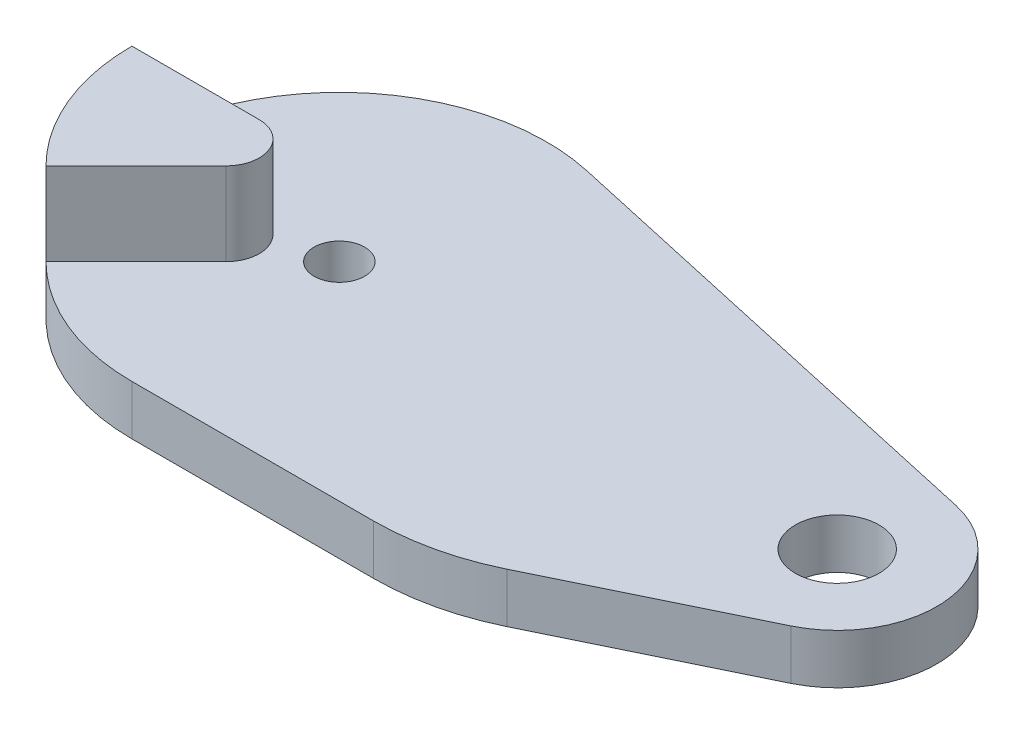
ISO-10303-21;
HEADER;
FILE_DESCRIPTION(('STEP AP214'),'2;1');
FILE_NAME('part.step','',(''),(''),'','','');
FILE_SCHEMA(('AUTOMOTIVE_DESIGN { 1 0 10303 214 1 1 1 1 }'));
ENDSEC;
DATA;
#1=APPLICATION_CONTEXT('core data for automotive mechanical design processes');
#2=APPLICATION_PROTOCOL_DEFINITION('international standard','automotive_design',2000,#1);
#3=PRODUCT_CONTEXT('',#1,'mechanical');
#4=PRODUCT('Part','Part','',(#3));
#5=PRODUCT_RELATED_PRODUCT_CATEGORY('part','',(#4));
#6=PRODUCT_DEFINITION_FORMATION('','',#4);
#7=PRODUCT_DEFINITION_CONTEXT('part definition',#1,'design');
#8=PRODUCT_DEFINITION('design','',#6,#7);
#9=PRODUCT_DEFINITION_SHAPE('','',#8);
#10=(LENGTH_UNIT() NAMED_UNIT(*) SI_UNIT(.MILLI.,.METRE.));
#11=(NAMED_UNIT(*) PLANE_ANGLE_UNIT() SI_UNIT($,.RADIAN.));
#12=(NAMED_UNIT(*) SI_UNIT($,.STERADIAN.) SOLID_ANGLE_UNIT());
#13=UNCERTAINTY_MEASURE_WITH_UNIT(LENGTH_MEASURE(1.E-05),#10,'distance_accuracy_value','');
#14=(GEOMETRIC_REPRESENTATION_CONTEXT(3) GLOBAL_UNCERTAINTY_ASSIGNED_CONTEXT((#13)) GLOBAL_UNIT_ASSIGNED_CONTEXT((#10,
#11,#12)) REPRESENTATION_CONTEXT('',''));
#15=CARTESIAN_POINT('',(0.,0.,0.));
#16=DIRECTION('',(0.,0.,1.));
#17=DIRECTION('',(1.,0.,0.));
#18=AXIS2_PLACEMENT_3D('',#15,#16,#17);
#19=CARTESIAN_POINT('',(0.,0.,0.));
#20=DIRECTION('',(0.,1.,0.));
#21=DIRECTION('',(0.,0.,1.));
#22=AXIS2_PLACEMENT_3D('',#19,#20,#21);
#23=PLANE('',#22);
#24=CARTESIAN_POINT('',(0.,0.,0.));
#25=DIRECTION('',(0.,1.,0.));
#26=DIRECTION('',(0.,0.,1.));
#27=AXIS2_PLACEMENT_3D('',#24,#25,#26);
#28=CIRCLE('',#27,3.05);
#29=CARTESIAN_POINT('',(0.,0.,3.05));
#30=VERTEX_POINT('',#29);
#31=EDGE_CURVE('E187',#30,#30,#28,.T.);
#32=ORIENTED_EDGE('',*,*,#31,.T.);
#33=EDGE_LOOP('',(#32));
#34=FACE_BOUND('',#33,.T.);
#35=CARTESIAN_POINT('',(0.,0.,0.));
#36=DIRECTION('',(0.,1.,0.));
#37=DIRECTION('',(0.,0.,1.));
#38=AXIS2_PLACEMENT_3D('',#35,#36,#37);
#39=CIRCLE('',#38,12.5);
#40=CARTESIAN_POINT('',(5.93717104351896,0.,11.));
#41=VERTEX_POINT('',#40);
#42=CARTESIAN_POINT('',(5.93717104351896,0.,-11.));
#43=VERTEX_POINT('',#42);
#44=EDGE_CURVE('E183',#41,#43,#39,.T.);
#45=ORIENTED_EDGE('',*,*,#44,.F.);
#46=DIRECTION('',(1.,0.,0.));
#47=VECTOR('',#46,1.);
#48=CARTESIAN_POINT('',(0.,0.,11.));
#49=LINE('',#48,#47);
#50=CARTESIAN_POINT('',(-5.93717104351896,0.,11.));
#51=VERTEX_POINT('',#50);
#52=EDGE_CURVE('E170',#51,#41,#49,.T.);
#53=ORIENTED_EDGE('',*,*,#52,.F.);
#54=CARTESIAN_POINT('',(-5.93717104351896,0.,-11.));
#55=VERTEX_POINT('',#54);
#56=EDGE_CURVE('E181',#55,#51,#39,.T.);
#57=ORIENTED_EDGE('',*,*,#56,.F.);
#58=DIRECTION('',(1.,0.,0.));
#59=VECTOR('',#58,1.);
#60=CARTESIAN_POINT('',(0.,0.,-11.));
#61=LINE('',#60,#59);
#62=EDGE_CURVE('E421',#55,#43,#61,.T.);
#63=ORIENTED_EDGE('',*,*,#62,.T.);
#64=EDGE_LOOP('',(#45,#53,#57,#63));
#65=FACE_BOUND('',#64,.T.);
#66=ADVANCED_FACE('F65',(#34,#65),#23,.F.);
#67=CARTESIAN_POINT('',(0.,8.,0.));
#68=DIRECTION('',(0.,-1.,0.));
#69=DIRECTION('',(0.,0.,-1.));
#70=AXIS2_PLACEMENT_3D('',#67,#68,#69);
#71=CYLINDRICAL_SURFACE('',#70,12.5);
#72=CARTESIAN_POINT('',(0.,6.,0.));
#73=DIRECTION('',(0.,-1.,0.));
#74=DIRECTION('',(0.,0.,-1.));
#75=AXIS2_PLACEMENT_3D('',#72,#73,#74);
#76=CIRCLE('',#75,12.5);
#77=CARTESIAN_POINT('',(5.93717104351896,6.,-11.));
#78=VERTEX_POINT('',#77);
#79=CARTESIAN_POINT('',(5.93717104351896,6.,11.));
#80=VERTEX_POINT('',#79);
#81=EDGE_CURVE('E350',#78,#80,#76,.T.);
#82=ORIENTED_EDGE('',*,*,#81,.T.);
#83=DIRECTION('',(0.,-1.,0.));
#84=VECTOR('',#83,1.);
#85=CARTESIAN_POINT('',(5.93717104351896,17.9687092035858,11.));
#86=LINE('',#85,#84);
#87=EDGE_CURVE('E175',#80,#41,#86,.T.);
#88=ORIENTED_EDGE('',*,*,#87,.T.);
#89=ORIENTED_EDGE('',*,*,#44,.T.);
#90=DIRECTION('',(0.,-1.,0.));
#91=VECTOR('',#90,1.);
#92=CARTESIAN_POINT('',(5.93717104351896,17.9687092035858,-11.));
#93=LINE('',#92,#91);
#94=EDGE_CURVE('E420',#78,#43,#93,.T.);
#95=ORIENTED_EDGE('',*,*,#94,.F.);
#96=EDGE_LOOP('',(#82,#88,#89,#95));
#97=FACE_BOUND('',#96,.T.);
#98=ADVANCED_FACE('F278',(#97),#71,.T.);
#99=ORIENTED_EDGE('',*,*,#56,.T.);
#100=DIRECTION('',(0.,-1.,0.));
#101=VECTOR('',#100,1.);
#102=CARTESIAN_POINT('',(-5.93717104351896,17.9687092035858,11.));
#103=LINE('',#102,#101);
#104=CARTESIAN_POINT('',(-5.93717104351896,6.,11.));
#105=VERTEX_POINT('',#104);
#106=EDGE_CURVE('E166',#105,#51,#103,.T.);
#107=ORIENTED_EDGE('',*,*,#106,.F.);
#108=CARTESIAN_POINT('',(-5.93717104351896,6.,-11.));
#109=VERTEX_POINT('',#108);
#110=EDGE_CURVE('E349',#105,#109,#76,.T.);
#111=ORIENTED_EDGE('',*,*,#110,.T.);
#112=DIRECTION('',(0.,-1.,0.));
#113=VECTOR('',#112,1.);
#114=CARTESIAN_POINT('',(-5.93717104351896,17.9687092035858,-11.));
#115=LINE('',#114,#113);
#116=EDGE_CURVE('E81',#109,#55,#115,.T.);
#117=ORIENTED_EDGE('',*,*,#116,.T.);
#118=EDGE_LOOP('',(#99,#107,#111,#117));
#119=FACE_BOUND('',#118,.T.);
#120=ADVANCED_FACE('F186',(#119),#71,.T.);
#121=CARTESIAN_POINT('',(0.,3.3,-12.5));
#122=DIRECTION('',(0.,0.,1.));
#123=DIRECTION('',(1.,0.,0.));
#124=AXIS2_PLACEMENT_3D('',#121,#122,#123);
#125=CYLINDRICAL_SURFACE('',#124,1.6);
#126=CARTESIAN_POINT('',(0.,4.9,-3.05));
#127=CARTESIAN_POINT('',(-0.0836110050453581,4.89999455650102,-3.04999517700509));
#128=CARTESIAN_POINT('',(-0.167306428380569,4.89340785872216,-3.04652589814843));
#129=CARTESIAN_POINT('',(-0.332191821665101,4.86736761047759,-3.03298901559862));
#130=CARTESIAN_POINT('',(-0.41337744453983,4.84789291591933,-3.02291056912914));
#131=CARTESIAN_POINT('',(-0.570613153127324,4.79706399807992,-2.99720260155738));
#132=CARTESIAN_POINT('',(-0.64668239885405,4.76575738147327,-2.98159534164387));
#133=CARTESIAN_POINT('',(-0.792357900481189,4.69241738866397,-2.94623419512776));
#134=CARTESIAN_POINT('',(-0.861964263345972,4.65038419003549,-2.92648037717069));
#135=CARTESIAN_POINT('',(-0.997798318782131,4.55371076067794,-2.88310679073146));
#136=CARTESIAN_POINT('',(-1.06351666988197,4.49843117858787,-2.859319653945));
#137=CARTESIAN_POINT('',(-1.18522587445246,4.37822360035397,-2.81105572902165));
#138=CARTESIAN_POINT('',(-1.24120850706307,4.31328753525379,-2.78657837813787));
#139=CARTESIAN_POINT('',(-1.3467876012229,4.16882083429098,-2.73721560194913));
#140=CARTESIAN_POINT('',(-1.39539667719393,4.08851034451157,-2.71248186972032));
#141=CARTESIAN_POINT('',(-1.47821785577007,3.91944545804245,-2.66825595257666));
#142=CARTESIAN_POINT('',(-1.51244089981633,3.83069754174642,-2.64875978826508));
#143=CARTESIAN_POINT('',(-1.56317686282866,3.65282461369514,-2.61912187860583));
#144=CARTESIAN_POINT('',(-1.5806560469441,3.56406395204097,-2.60847521031483));
#145=CARTESIAN_POINT('',(-1.60032679539884,3.38428674524894,-2.59645976696876));
#146=CARTESIAN_POINT('',(-1.60253644934951,3.29327299770229,-2.59508001357605));
#147=CARTESIAN_POINT('',(-1.59231112345977,3.12481316320863,-2.60135681056238));
#148=CARTESIAN_POINT('',(-1.58181195806415,3.04719343145767,-2.60781918576659));
#149=CARTESIAN_POINT('',(-1.54985517155484,2.89503685895057,-2.62693591844801));
#150=CARTESIAN_POINT('',(-1.52839341169479,2.82050119402981,-2.63959261441304));
#151=CARTESIAN_POINT('',(-1.47477217782312,2.67451021239191,-2.66992681382473));
#152=CARTESIAN_POINT('',(-1.44237993660731,2.60316388490232,-2.68771221954179));
#153=CARTESIAN_POINT('',(-1.36800477135078,2.46656234914093,-2.7263193459757));
#154=CARTESIAN_POINT('',(-1.32601756253087,2.40130988056908,-2.74714242170351));
#155=CARTESIAN_POINT('',(-1.22673326593071,2.26903155683991,-2.79303030943981));
#156=CARTESIAN_POINT('',(-1.16811065163519,2.20306057289718,-2.81827847110633));
#157=CARTESIAN_POINT('',(-1.04059337899233,2.08142080073434,-2.86781214667249));
#158=CARTESIAN_POINT('',(-0.971692869974616,2.02575792109897,-2.89209710223632));
#159=CARTESIAN_POINT('',(-0.820740647513362,1.9233543393171,-2.93861464263574));
#160=CARTESIAN_POINT('',(-0.738169212285077,1.87728596283712,-2.96065672738557));
#161=CARTESIAN_POINT('',(-0.565004905102359,1.80008897506982,-2.99851580446222));
#162=CARTESIAN_POINT('',(-0.474419068631023,1.76894741136602,-3.01433819164323));
#163=CARTESIAN_POINT('',(-0.296343036097651,1.72525207958017,-3.03677685758856));
#164=CARTESIAN_POINT('',(-0.209283174619134,1.71130246738174,-3.04408137162577));
#165=CARTESIAN_POINT('',(-0.0337678143322872,1.6979411600416,-3.05107459307041));
#166=CARTESIAN_POINT('',(0.0546868918974523,1.69852148648514,-3.05076748003652));
#167=CARTESIAN_POINT('',(0.222261120633014,1.71347654786282,-3.04294690530863));
#168=CARTESIAN_POINT('',(0.301522473378709,1.72664490565815,-3.03606369806689));
#169=CARTESIAN_POINT('',(0.456527872639768,1.76443893700297,-3.01665136822864));
#170=CARTESIAN_POINT('',(0.532271546832611,1.78906582033417,-3.00412164948249));
#171=CARTESIAN_POINT('',(0.680409637622107,1.84961542063141,-2.97412294261102));
#172=CARTESIAN_POINT('',(0.752665352454752,1.88581575597123,-2.95653375763504));
#173=CARTESIAN_POINT('',(0.890294387704052,1.9681537821101,-2.91804565699983));
#174=CARTESIAN_POINT('',(0.955664928691706,2.01429546334583,-2.89714541318244));
#175=CARTESIAN_POINT('',(1.08498511623705,2.12078716825915,-2.85140171616678));
#176=CARTESIAN_POINT('',(1.14806026144041,2.18212172109822,-2.82637478821565));
#177=CARTESIAN_POINT('',(1.26345922508927,2.31441119365977,-2.77671130755486));
#178=CARTESIAN_POINT('',(1.31577375066828,2.38537434160053,-2.7520751090808));
#179=CARTESIAN_POINT('',(1.41129657900498,2.5403745197948,-2.70439793263665));
#180=CARTESIAN_POINT('',(1.45373748753615,2.62494981651054,-2.6815510703486));
#181=CARTESIAN_POINT('',(1.52334205942745,2.80159483835205,-2.64263875687894));
#182=CARTESIAN_POINT('',(1.55052704827709,2.89365389503911,-2.62656384740357));
#183=CARTESIAN_POINT('',(1.58620051535253,3.07307748344927,-2.60516086699517));
#184=CARTESIAN_POINT('',(1.59625878046835,3.16001932668319,-2.59893477717467));
#185=CARTESIAN_POINT('',(1.60200350958647,3.33453714083777,-2.59540043680358));
#186=CARTESIAN_POINT('',(1.59769866270163,3.42211269639874,-2.5980867945703));
#187=CARTESIAN_POINT('',(1.57634037251977,3.58479140400219,-2.6110861836083));
#188=CARTESIAN_POINT('',(1.56080020023768,3.66017609553527,-2.62049247072563));
#189=CARTESIAN_POINT('',(1.51941962429058,3.8071449722835,-2.64469943748282));
#190=CARTESIAN_POINT('',(1.49357556899147,3.87872779993836,-2.65950202938117));
#191=CARTESIAN_POINT('',(1.43045670677683,4.0212953716003,-2.69400519922494));
#192=CARTESIAN_POINT('',(1.39254346462314,4.09193309027499,-2.71396330851015));
#193=CARTESIAN_POINT('',(1.30701559790143,4.22631627316641,-2.7561720524641));
#194=CARTESIAN_POINT('',(1.25939575644108,4.29005800275725,-2.7784239167382));
#195=CARTESIAN_POINT('',(1.14810442822523,4.41803657579401,-2.82639569886052));
#196=CARTESIAN_POINT('',(1.08312351653135,4.48112091253596,-2.85216935720769));
#197=CARTESIAN_POINT('',(0.942903791930802,4.59581536913892,-2.9015436493127));
#198=CARTESIAN_POINT('',(0.867658720167137,4.6474184370686,-2.92514294236523));
#199=CARTESIAN_POINT('',(0.706919773010004,4.73838586255544,-2.96813330877579));
#200=CARTESIAN_POINT('',(0.621256595958553,4.77749570553711,-2.98743470182243));
#201=CARTESIAN_POINT('',(0.443338336959858,4.84022493559491,-3.01894839595394));
#202=CARTESIAN_POINT('',(0.35110195214757,4.86388645600461,-3.03117996852047));
#203=CARTESIAN_POINT('',(0.214843288011331,4.8860963019435,-3.04272489307524));
#204=CARTESIAN_POINT('',(0.172094969544414,4.89130106575374,-3.04544427350963));
#205=CARTESIAN_POINT('',(0.0862385933399973,4.89825435315199,-3.04908308883221));
#206=CARTESIAN_POINT('',(0.0431305284664786,4.90000280801538,-3.0500024879299));
#207=CARTESIAN_POINT('',(0.,4.9,-3.05));
#208=B_SPLINE_CURVE_WITH_KNOTS('',3,(#126,#127,#128,#129,#130,#131,#132,#133,#134,#135,#136,
#137,#138,#139,#140,#141,#142,#143,#144,#145,#146,#147,#148,#149,#150,#151,#152,#153,#154,#155,
#156,#157,#158,#159,#160,#161,#162,#163,#164,#165,#166,#167,#168,#169,#170,#171,#172,#173,#174,
#175,#176,#177,#178,#179,#180,#181,#182,#183,#184,#185,#186,#187,#188,#189,#190,#191,#192,#193,
#194,#195,#196,#197,#198,#199,#200,#201,#202,#203,#204,#205,#206,#207),.UNSPECIFIED.,.T.,.F.,(4,
2,2,2,2,2,2,2,2,2,2,2,2,2,2,2,2,2,2,2,2,2,2,2,2,2,2,2,2,2,2,2,2,2,2,2,2,2,2,2,4),(0.,
0.250658754208306,0.501729762912424,0.751801140503482,1.00186837853366,1.26810210223369,
1.53455955403315,1.82433168016992,2.1138830166977,2.38548666885169,2.65676850048792,
2.89144544038274,3.12621104423379,3.36632969040414,3.60655577548953,3.88076383655907,
4.15512858991027,4.44482381121525,4.73426719867742,4.99821133082684,5.26201053397124,
5.50282368426325,5.74366226518102,5.99077646561658,6.23799004262053,6.51123596988036,
6.78471689052737,7.07518363207381,7.36524332677427,7.62690724924094,7.88841290412563,
8.12003101787473,8.35173128875636,8.5986251672399,8.84565209243475,9.12686877824567,
9.40825771675036,9.69505938135874,9.98107552659207,10.1103746489914,10.2396763423257),.UNSPECIFIED.);
#209=CARTESIAN_POINT('',(0.,4.9,-3.05));
#210=VERTEX_POINT('',#209);
#211=EDGE_CURVE('E191',#210,#210,#208,.T.);
#212=ORIENTED_EDGE('',*,*,#211,.T.);
#213=EDGE_LOOP('',(#212));
#214=FACE_BOUND('',#213,.T.);
#215=CARTESIAN_POINT('',(0.,3.3,-11.));
#216=DIRECTION('',(0.,0.,-1.));
#217=DIRECTION('',(-1.,0.,0.));
#218=AXIS2_PLACEMENT_3D('',#215,#216,#217);
#219=CIRCLE('',#218,1.6);
#220=CARTESIAN_POINT('',(-1.6,3.3,-11.));
#221=VERTEX_POINT('',#220);
#222=EDGE_CURVE('E69',#221,#221,#219,.F.);
#223=ORIENTED_EDGE('',*,*,#222,.F.);
#224=EDGE_LOOP('',(#223));
#225=FACE_BOUND('',#224,.T.);
#226=ADVANCED_FACE('F211',(#214,#225),#125,.F.);
#227=CARTESIAN_POINT('',(60.,14.,0.));
#228=DIRECTION('',(0.,1.,0.));
#229=DIRECTION('',(0.,0.,1.));
#230=AXIS2_PLACEMENT_3D('',#227,#228,#229);
#231=PLANE('',#230);
#232=CARTESIAN_POINT('',(0.,14.,0.));
#233=DIRECTION('',(0.,1.,0.));
#234=DIRECTION('',(0.,0.,1.));
#235=AXIS2_PLACEMENT_3D('',#232,#233,#234);
#236=CIRCLE('',#235,3.05);
#237=CARTESIAN_POINT('',(0.,14.,3.05));
#238=VERTEX_POINT('',#237);
#239=EDGE_CURVE('E338',#238,#238,#236,.F.);
#240=ORIENTED_EDGE('',*,*,#239,.T.);
#241=EDGE_LOOP('',(#240));
#242=FACE_BOUND('',#241,.T.);
#243=DIRECTION('',(-1.,0.,0.));
#244=VECTOR('',#243,1.);
#245=CARTESIAN_POINT('',(0.,14.,0.));
#246=LINE('',#245,#244);
#247=CARTESIAN_POINT('',(-9.65685424949236,14.,0.));
#248=VERTEX_POINT('',#247);
#249=CARTESIAN_POINT('',(-25.,14.,-1.72084568816899E-13));
#250=VERTEX_POINT('',#249);
#251=EDGE_CURVE('E334',#248,#250,#246,.T.);
#252=ORIENTED_EDGE('',*,*,#251,.F.);
#253=CARTESIAN_POINT('',(-9.65685424949239,14.,3.99999999999993));
#254=DIRECTION('',(0.,1.,0.));
#255=DIRECTION('',(0.,0.,1.));
#256=AXIS2_PLACEMENT_3D('',#253,#254,#255);
#257=CIRCLE('',#256,4.);
#258=CARTESIAN_POINT('',(-6.82842712474621,14.,6.82842712474614));
#259=VERTEX_POINT('',#258);
#260=EDGE_CURVE('E12',#248,#259,#257,.F.);
#261=ORIENTED_EDGE('',*,*,#260,.T.);
#262=DIRECTION('',(0.707106781186551,0.,-0.707106781186544));
#263=VECTOR('',#262,1.);
#264=CARTESIAN_POINT('',(0.,14.,0.));
#265=LINE('',#264,#263);
#266=CARTESIAN_POINT('',(-17.6776695296638,14.,17.6776695296636));
#267=VERTEX_POINT('',#266);
#268=EDGE_CURVE('E331',#267,#259,#265,.T.);
#269=ORIENTED_EDGE('',*,*,#268,.F.);
#270=CARTESIAN_POINT('',(0.,14.,0.));
#271=DIRECTION('',(0.,-1.,0.));
#272=DIRECTION('',(0.,0.,-1.));
#273=AXIS2_PLACEMENT_3D('',#270,#271,#272);
#274=CIRCLE('',#273,25.);
#275=CARTESIAN_POINT('',(0.,14.,25.));
#276=VERTEX_POINT('',#275);
#277=EDGE_CURVE('E369',#276,#267,#274,.T.);
#278=ORIENTED_EDGE('',*,*,#277,.F.);
#279=DIRECTION('',(1.,0.,0.));
#280=VECTOR('',#279,1.);
#281=CARTESIAN_POINT('',(0.,14.,25.));
#282=LINE('',#281,#280);
#283=CARTESIAN_POINT('',(29.0987542589046,14.,25.));
#284=VERTEX_POINT('',#283);
#285=EDGE_CURVE('E371',#276,#284,#282,.T.);
#286=ORIENTED_EDGE('',*,*,#285,.T.);
#287=CARTESIAN_POINT('',(29.0987542589046,14.,-5.));
#288=DIRECTION('',(0.,1.,0.));
#289=DIRECTION('',(0.,0.,1.));
#290=AXIS2_PLACEMENT_3D('',#287,#288,#289);
#291=CIRCLE('',#290,30.);
#292=CARTESIAN_POINT('',(42.2075405291071,14.,21.9844348193945));
#293=VERTEX_POINT('',#292);
#294=EDGE_CURVE('E300',#284,#293,#291,.T.);
#295=ORIENTED_EDGE('',*,*,#294,.T.);
#296=DIRECTION('',(0.899481160646483,0.,-0.436959542340085));
#297=VECTOR('',#296,1.);
#298=CARTESIAN_POINT('',(36.,14.,25.));
#299=LINE('',#298,#297);
#300=CARTESIAN_POINT('',(65.243514508081,14.,10.7937739277578));
#301=VERTEX_POINT('',#300);
#302=EDGE_CURVE('E360',#293,#301,#299,.T.);
#303=ORIENTED_EDGE('',*,*,#302,.T.);
#304=CARTESIAN_POINT('',(60.,14.,0.));
#305=DIRECTION('',(0.,1.,0.));
#306=DIRECTION('',(0.,0.,1.));
#307=AXIS2_PLACEMENT_3D('',#304,#305,#306);
#308=CIRCLE('',#307,12.);
#309=CARTESIAN_POINT('',(62.6,14.,-11.714947716486));
#310=VERTEX_POINT('',#309);
#311=EDGE_CURVE('E362',#301,#310,#308,.T.);
#312=ORIENTED_EDGE('',*,*,#311,.T.);
#313=DIRECTION('',(0.976245643040498,0.,0.216666666666667));
#314=VECTOR('',#313,1.);
#315=CARTESIAN_POINT('',(5.41666666666667,14.,-24.4061410760125));
#316=LINE('',#315,#314);
#317=CARTESIAN_POINT('',(5.41666666666667,14.,-24.4061410760125));
#318=VERTEX_POINT('',#317);
#319=EDGE_CURVE('E365',#318,#310,#316,.T.);
#320=ORIENTED_EDGE('',*,*,#319,.F.);
#321=EDGE_CURVE('E368',#250,#318,#274,.T.);
#322=ORIENTED_EDGE('',*,*,#321,.F.);
#323=EDGE_LOOP('',(#252,#261,#269,#278,#286,#295,#303,#312,#320,#322));
#324=FACE_BOUND('',#323,.T.);
#325=CARTESIAN_POINT('',(60.,14.,0.));
#326=DIRECTION('',(0.,1.,0.));
#327=DIRECTION('',(0.,0.,1.));
#328=AXIS2_PLACEMENT_3D('',#325,#326,#327);
#329=CIRCLE('',#328,5.05);
#330=CARTESIAN_POINT('',(60.,14.,5.05));
#331=VERTEX_POINT('',#330);
#332=EDGE_CURVE('E354',#331,#331,#329,.T.);
#333=ORIENTED_EDGE('',*,*,#332,.F.);
#334=EDGE_LOOP('',(#333));
#335=FACE_BOUND('',#334,.T.);
#336=ADVANCED_FACE('F215',(#242,#324,#335),#231,.T.);
#337=CARTESIAN_POINT('',(60.,8.,0.));
#338=DIRECTION('',(0.,1.,0.));
#339=DIRECTION('',(0.,0.,1.));
#340=AXIS2_PLACEMENT_3D('',#337,#338,#339);
#341=PLANE('',#340);
#342=CARTESIAN_POINT('',(0.,8.,0.));
#343=DIRECTION('',(0.,1.,0.));
#344=DIRECTION('',(0.,0.,1.));
#345=AXIS2_PLACEMENT_3D('',#342,#343,#344);
#346=CIRCLE('',#345,18.);
#347=CARTESIAN_POINT('',(0.,8.,18.));
#348=VERTEX_POINT('',#347);
#349=EDGE_CURVE('E189',#348,#348,#346,.F.);
#350=ORIENTED_EDGE('',*,*,#349,.F.);
#351=EDGE_LOOP('',(#350));
#352=FACE_BOUND('',#351,.T.);
#353=DIRECTION('',(0.899481160646483,0.,-0.436959542340085));
#354=VECTOR('',#353,1.);
#355=CARTESIAN_POINT('',(36.,8.,25.));
#356=LINE('',#355,#354);
#357=CARTESIAN_POINT('',(42.2075405291071,8.,21.9844348193945));
#358=VERTEX_POINT('',#357);
#359=CARTESIAN_POINT('',(65.243514508081,8.,10.7937739277578));
#360=VERTEX_POINT('',#359);
#361=EDGE_CURVE('E357',#358,#360,#356,.T.);
#362=ORIENTED_EDGE('',*,*,#361,.F.);
#363=CARTESIAN_POINT('',(29.0987542589046,8.,-5.));
#364=DIRECTION('',(0.,1.,0.));
#365=DIRECTION('',(0.,0.,1.));
#366=AXIS2_PLACEMENT_3D('',#363,#364,#365);
#367=CIRCLE('',#366,30.);
#368=CARTESIAN_POINT('',(29.0987542589046,8.,25.));
#369=VERTEX_POINT('',#368);
#370=EDGE_CURVE('E411',#358,#369,#367,.F.);
#371=ORIENTED_EDGE('',*,*,#370,.T.);
#372=DIRECTION('',(1.,0.,0.));
#373=VECTOR('',#372,1.);
#374=CARTESIAN_POINT('',(0.,8.,25.));
#375=LINE('',#374,#373);
#376=CARTESIAN_POINT('',(0.,8.,25.));
#377=VERTEX_POINT('',#376);
#378=EDGE_CURVE('E363',#377,#369,#375,.T.);
#379=ORIENTED_EDGE('',*,*,#378,.F.);
#380=CARTESIAN_POINT('',(0.,8.,0.));
#381=DIRECTION('',(0.,-1.,0.));
#382=DIRECTION('',(0.,0.,-1.));
#383=AXIS2_PLACEMENT_3D('',#380,#381,#382);
#384=CIRCLE('',#383,25.);
#385=CARTESIAN_POINT('',(5.41666666666667,8.,-24.4061410760125));
#386=VERTEX_POINT('',#385);
#387=EDGE_CURVE('E382',#377,#386,#384,.T.);
#388=ORIENTED_EDGE('',*,*,#387,.T.);
#389=DIRECTION('',(0.976245643040498,0.,0.216666666666667));
#390=VECTOR('',#389,1.);
#391=CARTESIAN_POINT('',(5.41666666666667,8.,-24.4061410760125));
#392=LINE('',#391,#390);
#393=CARTESIAN_POINT('',(62.6,8.,-11.714947716486));
#394=VERTEX_POINT('',#393);
#395=EDGE_CURVE('E379',#386,#394,#392,.T.);
#396=ORIENTED_EDGE('',*,*,#395,.T.);
#397=CARTESIAN_POINT('',(60.,8.,0.));
#398=DIRECTION('',(0.,1.,0.));
#399=DIRECTION('',(0.,0.,1.));
#400=AXIS2_PLACEMENT_3D('',#397,#398,#399);
#401=CIRCLE('',#400,12.);
#402=EDGE_CURVE('E376',#360,#394,#401,.T.);
#403=ORIENTED_EDGE('',*,*,#402,.F.);
#404=EDGE_LOOP('',(#362,#371,#379,#388,#396,#403));
#405=FACE_BOUND('',#404,.T.);
#406=CARTESIAN_POINT('',(60.,8.,0.));
#407=DIRECTION('',(0.,1.,0.));
#408=DIRECTION('',(0.,0.,1.));
#409=AXIS2_PLACEMENT_3D('',#406,#407,#408);
#410=CIRCLE('',#409,5.05);
#411=CARTESIAN_POINT('',(60.,8.,5.05));
#412=VERTEX_POINT('',#411);
#413=EDGE_CURVE('E353',#412,#412,#410,.T.);
#414=ORIENTED_EDGE('',*,*,#413,.T.);
#415=EDGE_LOOP('',(#414));
#416=FACE_BOUND('',#415,.T.);
#417=ADVANCED_FACE('F223',(#352,#405,#416),#341,.F.);
#418=CARTESIAN_POINT('',(36.,14.,25.));
#419=DIRECTION('',(-0.436959542340085,0.,-0.899481160646482));
#420=DIRECTION('',(-0.899481160646483,0.,0.436959542340085));
#421=AXIS2_PLACEMENT_3D('',#418,#419,#420);
#422=PLANE('',#421);
#423=ORIENTED_EDGE('',*,*,#302,.F.);
#424=DIRECTION('',(0.,-1.,0.));
#425=VECTOR('',#424,1.);
#426=CARTESIAN_POINT('',(42.2075405291071,14.,21.9844348193945));
#427=LINE('',#426,#425);
#428=EDGE_CURVE('E400',#293,#358,#427,.T.);
#429=ORIENTED_EDGE('',*,*,#428,.T.);
#430=ORIENTED_EDGE('',*,*,#361,.T.);
#431=DIRECTION('',(0.,-1.,0.));
#432=VECTOR('',#431,1.);
#433=CARTESIAN_POINT('',(65.243514508081,14.,10.7937739277578));
#434=LINE('',#433,#432);
#435=EDGE_CURVE('E203',#301,#360,#434,.T.);
#436=ORIENTED_EDGE('',*,*,#435,.F.);
#437=EDGE_LOOP('',(#423,#429,#430,#436));
#438=FACE_BOUND('',#437,.T.);
#439=ADVANCED_FACE('F218',(#438),#422,.F.);
#440=CARTESIAN_POINT('',(60.,14.,0.));
#441=DIRECTION('',(0.,-1.,0.));
#442=DIRECTION('',(0.,0.,-1.));
#443=AXIS2_PLACEMENT_3D('',#440,#441,#442);
#444=CYLINDRICAL_SURFACE('',#443,12.);
#445=ORIENTED_EDGE('',*,*,#402,.T.);
#446=DIRECTION('',(0.,-1.,0.));
#447=VECTOR('',#446,1.);
#448=CARTESIAN_POINT('',(62.6,14.,-11.714947716486));
#449=LINE('',#448,#447);
#450=EDGE_CURVE('E390',#310,#394,#449,.T.);
#451=ORIENTED_EDGE('',*,*,#450,.F.);
#452=ORIENTED_EDGE('',*,*,#311,.F.);
#453=ORIENTED_EDGE('',*,*,#435,.T.);
#454=EDGE_LOOP('',(#445,#451,#452,#453));
#455=FACE_BOUND('',#454,.T.);
#456=ADVANCED_FACE('F222',(#455),#444,.T.);
#457=CARTESIAN_POINT('',(5.41666666666667,14.,-24.4061410760125));
#458=DIRECTION('',(0.216666666666667,0.,-0.976245643040498));
#459=DIRECTION('',(-0.976245643040498,0.,-0.216666666666667));
#460=AXIS2_PLACEMENT_3D('',#457,#458,#459);
#461=PLANE('',#460);
#462=ORIENTED_EDGE('',*,*,#395,.F.);
#463=DIRECTION('',(0.,-1.,0.));
#464=VECTOR('',#463,1.);
#465=CARTESIAN_POINT('',(5.41666666666667,14.,-24.4061410760125));
#466=LINE('',#465,#464);
#467=EDGE_CURVE('E388',#318,#386,#466,.T.);
#468=ORIENTED_EDGE('',*,*,#467,.F.);
#469=ORIENTED_EDGE('',*,*,#319,.T.);
#470=ORIENTED_EDGE('',*,*,#450,.T.);
#471=EDGE_LOOP('',(#462,#468,#469,#470));
#472=FACE_BOUND('',#471,.T.);
#473=ADVANCED_FACE('F227',(#472),#461,.T.);
#474=CARTESIAN_POINT('',(0.,14.,0.));
#475=DIRECTION('',(0.,-1.,0.));
#476=DIRECTION('',(0.,0.,-1.));
#477=AXIS2_PLACEMENT_3D('',#474,#475,#476);
#478=CYLINDRICAL_SURFACE('',#477,25.);
#479=ORIENTED_EDGE('',*,*,#387,.F.);
#480=DIRECTION('',(0.,-1.,0.));
#481=VECTOR('',#480,1.);
#482=CARTESIAN_POINT('',(0.,14.,25.));
#483=LINE('',#482,#481);
#484=EDGE_CURVE('E374',#276,#377,#483,.T.);
#485=ORIENTED_EDGE('',*,*,#484,.F.);
#486=ORIENTED_EDGE('',*,*,#277,.T.);
#487=DIRECTION('',(0.,-1.,0.));
#488=VECTOR('',#487,1.);
#489=CARTESIAN_POINT('',(-17.6776695296638,24.,17.6776695296636));
#490=LINE('',#489,#488);
#491=CARTESIAN_POINT('',(-17.6776695296638,24.,17.6776695296636));
#492=VERTEX_POINT('',#491);
#493=EDGE_CURVE('E337',#492,#267,#490,.T.);
#494=ORIENTED_EDGE('',*,*,#493,.F.);
#495=CARTESIAN_POINT('',(0.,24.,0.));
#496=DIRECTION('',(0.,1.,0.));
#497=DIRECTION('',(0.,0.,-1.));
#498=AXIS2_PLACEMENT_3D('',#495,#496,#497);
#499=CIRCLE('',#498,25.);
#500=CARTESIAN_POINT('',(-25.,24.,-1.72084568816899E-13));
#501=VERTEX_POINT('',#500);
#502=EDGE_CURVE('E340',#501,#492,#499,.T.);
#503=ORIENTED_EDGE('',*,*,#502,.F.);
#504=DIRECTION('',(0.,-1.,0.));
#505=VECTOR('',#504,1.);
#506=CARTESIAN_POINT('',(-25.,24.,-1.72084568816899E-13));
#507=LINE('',#506,#505);
#508=EDGE_CURVE('E324',#501,#250,#507,.T.);
#509=ORIENTED_EDGE('',*,*,#508,.T.);
#510=ORIENTED_EDGE('',*,*,#321,.T.);
#511=ORIENTED_EDGE('',*,*,#467,.T.);
#512=EDGE_LOOP('',(#479,#485,#486,#494,#503,#509,#510,#511));
#513=FACE_BOUND('',#512,.T.);
#514=ADVANCED_FACE('F231',(#513),#478,.T.);
#515=CARTESIAN_POINT('',(0.,14.,25.));
#516=DIRECTION('',(0.,0.,-1.));
#517=DIRECTION('',(-1.,0.,0.));
#518=AXIS2_PLACEMENT_3D('',#515,#516,#517);
#519=PLANE('',#518);
#520=ORIENTED_EDGE('',*,*,#378,.T.);
#521=DIRECTION('',(0.,-1.,0.));
#522=VECTOR('',#521,1.);
#523=CARTESIAN_POINT('',(29.0987542589046,14.,25.));
#524=LINE('',#523,#522);
#525=EDGE_CURVE('E304',#369,#284,#524,.F.);
#526=ORIENTED_EDGE('',*,*,#525,.T.);
#527=ORIENTED_EDGE('',*,*,#285,.F.);
#528=ORIENTED_EDGE('',*,*,#484,.T.);
#529=EDGE_LOOP('',(#520,#526,#527,#528));
#530=FACE_BOUND('',#529,.T.);
#531=ADVANCED_FACE('F235',(#530),#519,.F.);
#532=CARTESIAN_POINT('',(60.,14.,0.));
#533=DIRECTION('',(0.,-1.,0.));
#534=DIRECTION('',(0.,0.,-1.));
#535=AXIS2_PLACEMENT_3D('',#532,#533,#534);
#536=CYLINDRICAL_SURFACE('',#535,5.05);
#537=ORIENTED_EDGE('',*,*,#332,.T.);
#538=EDGE_LOOP('',(#537));
#539=FACE_BOUND('',#538,.T.);
#540=ORIENTED_EDGE('',*,*,#413,.F.);
#541=EDGE_LOOP('',(#540));
#542=FACE_BOUND('',#541,.T.);
#543=ADVANCED_FACE('F239',(#539,#542),#536,.F.);
#544=CARTESIAN_POINT('',(0.,6.,0.));
#545=DIRECTION('',(0.,1.,0.));
#546=DIRECTION('',(0.,0.,1.));
#547=AXIS2_PLACEMENT_3D('',#544,#545,#546);
#548=CYLINDRICAL_SURFACE('',#547,18.);
#549=CARTESIAN_POINT('',(0.,7.,0.));
#550=DIRECTION('',(0.,-1.,0.));
#551=DIRECTION('',(0.,0.,-1.));
#552=AXIS2_PLACEMENT_3D('',#549,#550,#551);
#553=CIRCLE('',#552,18.);
#554=CARTESIAN_POINT('',(0.,7.,-18.));
#555=VERTEX_POINT('',#554);
#556=EDGE_CURVE('E296',#555,#555,#553,.F.);
#557=ORIENTED_EDGE('',*,*,#556,.T.);
#558=EDGE_LOOP('',(#557));
#559=FACE_BOUND('',#558,.T.);
#560=ORIENTED_EDGE('',*,*,#349,.T.);
#561=EDGE_LOOP('',(#560));
#562=FACE_BOUND('',#561,.T.);
#563=ADVANCED_FACE('F249',(#559,#562),#548,.T.);
#564=CARTESIAN_POINT('',(0.,6.,0.));
#565=DIRECTION('',(0.,-1.,0.));
#566=DIRECTION('',(0.,0.,-1.));
#567=AXIS2_PLACEMENT_3D('',#564,#565,#566);
#568=PLANE('',#567);
#569=CARTESIAN_POINT('',(0.,6.,0.));
#570=DIRECTION('',(0.,-1.,0.));
#571=DIRECTION('',(0.,0.,-1.));
#572=AXIS2_PLACEMENT_3D('',#569,#570,#571);
#573=CIRCLE('',#572,17.);
#574=CARTESIAN_POINT('',(0.,6.,-17.));
#575=VERTEX_POINT('',#574);
#576=EDGE_CURVE('E299',#575,#575,#573,.T.);
#577=ORIENTED_EDGE('',*,*,#576,.T.);
#578=EDGE_LOOP('',(#577));
#579=FACE_BOUND('',#578,.T.);
#580=ORIENTED_EDGE('',*,*,#81,.F.);
#581=DIRECTION('',(-1.,0.,0.));
#582=VECTOR('',#581,1.);
#583=CARTESIAN_POINT('',(0.,6.,-11.));
#584=LINE('',#583,#582);
#585=EDGE_CURVE('E184',#78,#109,#584,.T.);
#586=ORIENTED_EDGE('',*,*,#585,.T.);
#587=ORIENTED_EDGE('',*,*,#110,.F.);
#588=DIRECTION('',(-1.,0.,0.));
#589=VECTOR('',#588,1.);
#590=CARTESIAN_POINT('',(0.,6.,11.));
#591=LINE('',#590,#589);
#592=EDGE_CURVE('E89',#80,#105,#591,.T.);
#593=ORIENTED_EDGE('',*,*,#592,.F.);
#594=EDGE_LOOP('',(#580,#586,#587,#593));
#595=FACE_BOUND('',#594,.T.);
#596=ADVANCED_FACE('F253',(#579,#595),#568,.T.);
#597=CARTESIAN_POINT('',(0.,3.3,11.));
#598=DIRECTION('',(0.,0.,-1.));
#599=DIRECTION('',(-1.,0.,0.));
#600=AXIS2_PLACEMENT_3D('',#597,#598,#599);
#601=CIRCLE('',#600,1.6);
#602=CARTESIAN_POINT('',(-1.6,3.3,11.));
#603=VERTEX_POINT('',#602);
#604=EDGE_CURVE('E343',#603,#603,#601,.F.);
#605=ORIENTED_EDGE('',*,*,#604,.T.);
#606=EDGE_LOOP('',(#605));
#607=FACE_BOUND('',#606,.T.);
#608=CARTESIAN_POINT('',(1.6,3.3,2.59663243451976));
#609=CARTESIAN_POINT('',(1.59999378682515,3.21728336908306,2.5966406247906));
#610=CARTESIAN_POINT('',(1.59354188631742,3.13447730017785,2.60064619812031));
#611=CARTESIAN_POINT('',(1.56808778570973,2.97146003751286,2.61606711195034));
#612=CARTESIAN_POINT('',(1.54906183094383,2.89125405724305,2.62749647663372));
#613=CARTESIAN_POINT('',(1.49954113021347,2.73611025969944,2.65606483262483));
#614=CARTESIAN_POINT('',(1.46911228125232,2.66114505454085,2.6731709543272));
#615=CARTESIAN_POINT('',(1.39785171729525,2.5174058844161,2.71111334628363));
#616=CARTESIAN_POINT('',(1.3570185939043,2.44863275936013,2.73195012143128));
#617=CARTESIAN_POINT('',(1.26174270746287,2.31230720023514,2.77732475161168));
#618=CARTESIAN_POINT('',(1.2063976338372,2.24543976158504,2.80202682426253));
#619=CARTESIAN_POINT('',(1.08553906488092,2.12139518108461,2.85102776361114));
#620=CARTESIAN_POINT('',(1.02002007415775,2.06422331137226,2.8753264044991));
#621=CARTESIAN_POINT('',(0.874594001762126,1.95692417261597,2.92298952190269));
#622=CARTESIAN_POINT('',(0.793971605295546,1.90766343394898,2.94614238355477));
#623=CARTESIAN_POINT('',(0.624140360396243,1.82372044032032,2.98672863161971));
#624=CARTESIAN_POINT('',(0.534937521127975,1.78902807270669,3.00416598360904));
#625=CARTESIAN_POINT('',(0.357754793364664,1.73800023206223,3.0301651066957));
#626=CARTESIAN_POINT('',(0.270209982648431,1.7204565935108,3.03930709015545));
#627=CARTESIAN_POINT('',(0.0929815534821511,1.70022084871031,3.04987117410931));
#628=CARTESIAN_POINT('',(0.00329942358583375,1.69751869301561,3.05129849833305));
#629=CARTESIAN_POINT('',(-0.166470992165667,1.70663315004246,3.04652438501616));
#630=CARTESIAN_POINT('',(-0.246657591129589,1.71708791014774,3.04103845280307));
#631=CARTESIAN_POINT('',(-0.403943321949367,1.74974780240453,3.02416710451348));
#632=CARTESIAN_POINT('',(-0.481042219846809,1.77195382315647,3.01278124230064));
#633=CARTESIAN_POINT('',(-0.631216476791163,1.82756593033537,2.98495847081266));
#634=CARTESIAN_POINT('',(-0.704229177728559,1.86110911478043,2.9684599486628));
#635=CARTESIAN_POINT('',(-0.84375152909156,1.93822029841697,2.93185832553311));
#636=CARTESIAN_POINT('',(-0.910258939934253,1.98179173285538,2.91175398987883));
#637=CARTESIAN_POINT('',(-1.0420767093984,2.08276952377993,2.86738350312404));
#638=CARTESIAN_POINT('',(-1.10658405874401,2.14112999181727,2.8429020690454));
#639=CARTESIAN_POINT('',(-1.22535112595613,2.26750552259633,2.79377055914223));
#640=CARTESIAN_POINT('',(-1.27960158984626,2.33552920771896,2.76912035162433));
#641=CARTESIAN_POINT('',(-1.38033677374473,2.48549077611295,2.72039186197068));
#642=CARTESIAN_POINT('',(-1.4259348336903,2.56808937384454,2.69649488213014));
#643=CARTESIAN_POINT('',(-1.5022571515393,2.74129381735411,2.65473784106264));
#644=CARTESIAN_POINT('',(-1.53299799961659,2.8318905976618,2.63687105303479));
#645=CARTESIAN_POINT('',(-1.57612698279401,3.01087560446415,2.61130430365066));
#646=CARTESIAN_POINT('',(-1.58979923080418,3.09884903226371,2.60289846997844));
#647=CARTESIAN_POINT('',(-1.60228491747857,3.27620915308266,2.59523569234672));
#648=CARTESIAN_POINT('',(-1.6011115924491,3.36559451619968,2.59597059849775));
#649=CARTESIAN_POINT('',(-1.58511760779562,3.53116151483989,2.60575512673595));
#650=CARTESIAN_POINT('',(-1.57203842287316,3.60758553841578,2.61374342596883));
#651=CARTESIAN_POINT('',(-1.53528266022049,3.75697687789921,2.63549991834011));
#652=CARTESIAN_POINT('',(-1.51160214816485,3.82994289935817,2.64927025716985));
#653=CARTESIAN_POINT('',(-1.45322959765201,3.97412724518053,2.68174974411559));
#654=CARTESIAN_POINT('',(-1.41808922937968,4.04511845078683,2.70065357203117));
#655=CARTESIAN_POINT('',(-1.33817326689082,4.18061740055741,2.7411307907777));
#656=CARTESIAN_POINT('',(-1.2933927313099,4.24512179473586,2.76270554825678));
#657=CARTESIAN_POINT('',(-1.18808312943885,4.37537303945404,2.80975656593706));
#658=CARTESIAN_POINT('',(-1.12622238271025,4.44000489064608,2.83535300635257));
#659=CARTESIAN_POINT('',(-0.992222797928378,4.55836747788549,2.88497827981606));
#660=CARTESIAN_POINT('',(-0.920079341070078,4.61209328870607,2.90900640129412));
#661=CARTESIAN_POINT('',(-0.764016103392493,4.70890527722115,2.95391357117099));
#662=CARTESIAN_POINT('',(-0.679757936113717,4.75152098774501,2.97464211339182));
#663=CARTESIAN_POINT('',(-0.503869036284247,4.82152916833658,3.00942232856378));
#664=CARTESIAN_POINT('',(-0.412245486391411,4.8489362683874,3.0234804162913));
#665=CARTESIAN_POINT('',(-0.233826110618687,4.88517875798615,3.04221605889272));
#666=CARTESIAN_POINT('',(-0.147425899826333,4.89555958918264,3.04767218609955));
#667=CARTESIAN_POINT('',(0.0260479196843712,4.9021376125147,3.05112010390249));
#668=CARTESIAN_POINT('',(0.113121224114768,4.89834087802133,3.04911509069557));
#669=CARTESIAN_POINT('',(0.278375642799648,4.87762716063569,3.03831224097488));
#670=CARTESIAN_POINT('',(0.356725325444153,4.86174256106392,3.03004913922829));
#671=CARTESIAN_POINT('',(0.509488368865055,4.81878886006395,3.00813550823658));
#672=CARTESIAN_POINT('',(0.583901213674547,4.79171829666541,2.99448427479002));
#673=CARTESIAN_POINT('',(0.729996027487832,4.72610346469918,2.96233389197478));
#674=CARTESIAN_POINT('',(0.801455830619086,4.68715018499451,2.94366534218138));
#675=CARTESIAN_POINT('',(0.937095714074259,4.59937890150683,2.903337183477));
#676=CARTESIAN_POINT('',(1.00127255803255,4.55055653874344,2.88167625423381));
#677=CARTESIAN_POINT('',(1.12783472436127,4.43837145115244,2.83469928197568));
#678=CARTESIAN_POINT('',(1.18928310383978,4.3740091397267,2.80924080809593));
#679=CARTESIAN_POINT('',(1.30091441212686,4.23569639584213,2.75932420888937));
#680=CARTESIAN_POINT('',(1.35108557375162,4.16173607408739,2.73486715004211));
#681=CARTESIAN_POINT('',(1.44091474306906,4.00183438289632,2.68866860098067));
#682=CARTESIAN_POINT('',(1.47995685069716,3.91548971220008,2.66711237895743));
#683=CARTESIAN_POINT('',(1.54235731824472,3.73599373574798,2.63153054685436));
#684=CARTESIAN_POINT('',(1.56576743275709,3.64286603472091,2.61748011771928));
#685=CARTESIAN_POINT('',(1.58707767458726,3.5071480207924,2.60455933932952));
#686=CARTESIAN_POINT('',(1.59191412242778,3.4659323155885,2.60160020469477));
#687=CARTESIAN_POINT('',(1.59837693418277,3.38315195539119,2.59763464036943));
#688=CARTESIAN_POINT('',(1.60000312378598,3.34158728157245,2.59662831671303));
#689=CARTESIAN_POINT('',(1.6,3.3,2.59663243451976));
#690=B_SPLINE_CURVE_WITH_KNOTS('',3,(#608,#609,#610,#611,#612,#613,#614,#615,#616,#617,#618,
#619,#620,#621,#622,#623,#624,#625,#626,#627,#628,#629,#630,#631,#632,#633,#634,#635,#636,#637,
#638,#639,#640,#641,#642,#643,#644,#645,#646,#647,#648,#649,#650,#651,#652,#653,#654,#655,#656,
#657,#658,#659,#660,#661,#662,#663,#664,#665,#666,#667,#668,#669,#670,#671,#672,#673,#674,#675,
#676,#677,#678,#679,#680,#681,#682,#683,#684,#685,#686,#687,#688,#689),.UNSPECIFIED.,.T.,.F.,(4,
2,2,2,2,2,2,2,2,2,2,2,2,2,2,2,2,2,2,2,2,2,2,2,2,2,2,2,2,2,2,2,2,2,2,2,2,2,2,2,4),(0.,
0.247974327794149,0.49641846829394,0.743448459973143,0.990511909133791,1.26013717956819,
1.52990859667184,1.82019834306389,2.11028625005609,2.37802901354517,2.64559046103043,
2.88760065839093,3.12962915856249,3.3746959054861,3.61984672700968,3.8898191170145,
4.16003393139772,4.45049905898942,4.74063908756624,5.00729439409052,5.27371196762867,
5.50649820104012,5.73937089692823,5.98274290784291,6.22623996486918,6.50418160308525,
6.78224848336147,7.07066562330343,7.35880483613918,7.61895411864547,7.87899197145551,
8.11901424586534,8.35906790036015,8.60855321672455,8.85814896757966,9.13461962967586,
9.41137744883419,9.70134147592946,9.99034066263988,10.1150074699039,10.2396810461654),.UNSPECIFIED.);
#691=CARTESIAN_POINT('',(1.6,3.3,2.59663243451976));
#692=VERTEX_POINT('',#691);
#693=EDGE_CURVE('E195',#692,#692,#690,.T.);
#694=ORIENTED_EDGE('',*,*,#693,.T.);
#695=EDGE_LOOP('',(#694));
#696=FACE_BOUND('',#695,.T.);
#697=ADVANCED_FACE('F217',(#607,#696),#125,.F.);
#698=CARTESIAN_POINT('',(0.,8.,0.));
#699=DIRECTION('',(0.,-1.,0.));
#700=DIRECTION('',(0.,0.,-1.));
#701=AXIS2_PLACEMENT_3D('',#698,#699,#700);
#702=CYLINDRICAL_SURFACE('',#701,3.05);
#703=ORIENTED_EDGE('',*,*,#211,.F.);
#704=EDGE_LOOP('',(#703));
#705=FACE_BOUND('',#704,.T.);
#706=ORIENTED_EDGE('',*,*,#693,.F.);
#707=EDGE_LOOP('',(#706));
#708=FACE_BOUND('',#707,.T.);
#709=ORIENTED_EDGE('',*,*,#31,.F.);
#710=EDGE_LOOP('',(#709));
#711=FACE_BOUND('',#710,.T.);
#712=ORIENTED_EDGE('',*,*,#239,.F.);
#713=EDGE_LOOP('',(#712));
#714=FACE_BOUND('',#713,.T.);
#715=ADVANCED_FACE('F208',(#705,#708,#711,#714),#702,.F.);
#716=CARTESIAN_POINT('',(29.0987542589046,14.,-5.));
#717=DIRECTION('',(0.,-1.,0.));
#718=DIRECTION('',(0.,0.,-1.));
#719=AXIS2_PLACEMENT_3D('',#716,#717,#718);
#720=CYLINDRICAL_SURFACE('',#719,30.);
#721=ORIENTED_EDGE('',*,*,#294,.F.);
#722=ORIENTED_EDGE('',*,*,#525,.F.);
#723=ORIENTED_EDGE('',*,*,#370,.F.);
#724=ORIENTED_EDGE('',*,*,#428,.F.);
#725=EDGE_LOOP('',(#721,#722,#723,#724));
#726=FACE_BOUND('',#725,.T.);
#727=ADVANCED_FACE('F286',(#726),#720,.T.);
#728=CARTESIAN_POINT('',(0.,7.,0.));
#729=DIRECTION('',(0.,-1.,0.));
#730=DIRECTION('',(0.,0.,-1.));
#731=AXIS2_PLACEMENT_3D('',#728,#729,#730);
#732=TOROIDAL_SURFACE('',#731,17.,1.);
#733=ORIENTED_EDGE('',*,*,#556,.F.);
#734=EDGE_LOOP('',(#733));
#735=FACE_BOUND('',#734,.T.);
#736=ORIENTED_EDGE('',*,*,#576,.F.);
#737=EDGE_LOOP('',(#736));
#738=FACE_BOUND('',#737,.T.);
#739=ADVANCED_FACE('F262',(#735,#738),#732,.T.);
#740=CARTESIAN_POINT('',(0.,24.,0.));
#741=DIRECTION('',(-0.707106781186544,0.,-0.707106781186551));
#742=DIRECTION('',(-0.707106781186551,0.,0.707106781186544));
#743=AXIS2_PLACEMENT_3D('',#740,#741,#742);
#744=PLANE('',#743);
#745=ORIENTED_EDGE('',*,*,#268,.T.);
#746=DIRECTION('',(0.,-1.,0.));
#747=VECTOR('',#746,1.);
#748=CARTESIAN_POINT('',(-6.82842712474621,24.,6.82842712474614));
#749=LINE('',#748,#747);
#750=CARTESIAN_POINT('',(-6.82842712474621,24.,6.82842712474614));
#751=VERTEX_POINT('',#750);
#752=EDGE_CURVE('E310',#259,#751,#749,.F.);
#753=ORIENTED_EDGE('',*,*,#752,.T.);
#754=DIRECTION('',(0.707106781186551,0.,-0.707106781186544));
#755=VECTOR('',#754,1.);
#756=CARTESIAN_POINT('',(0.,24.,0.));
#757=LINE('',#756,#755);
#758=EDGE_CURVE('E318',#492,#751,#757,.T.);
#759=ORIENTED_EDGE('',*,*,#758,.F.);
#760=ORIENTED_EDGE('',*,*,#493,.T.);
#761=EDGE_LOOP('',(#745,#753,#759,#760));
#762=FACE_BOUND('',#761,.T.);
#763=ADVANCED_FACE('F258',(#762),#744,.F.);
#764=CARTESIAN_POINT('',(0.,24.,0.));
#765=DIRECTION('',(0.,0.,1.));
#766=DIRECTION('',(1.,0.,0.));
#767=AXIS2_PLACEMENT_3D('',#764,#765,#766);
#768=PLANE('',#767);
#769=DIRECTION('',(-1.,0.,0.));
#770=VECTOR('',#769,1.);
#771=CARTESIAN_POINT('',(0.,24.,0.));
#772=LINE('',#771,#770);
#773=CARTESIAN_POINT('',(-9.65685424949236,24.,0.));
#774=VERTEX_POINT('',#773);
#775=EDGE_CURVE('E316',#774,#501,#772,.T.);
#776=ORIENTED_EDGE('',*,*,#775,.F.);
#777=DIRECTION('',(0.,-1.,0.));
#778=VECTOR('',#777,1.);
#779=CARTESIAN_POINT('',(-9.65685424949236,24.,0.));
#780=LINE('',#779,#778);
#781=EDGE_CURVE('E302',#774,#248,#780,.T.);
#782=ORIENTED_EDGE('',*,*,#781,.T.);
#783=ORIENTED_EDGE('',*,*,#251,.T.);
#784=ORIENTED_EDGE('',*,*,#508,.F.);
#785=EDGE_LOOP('',(#776,#782,#783,#784));
#786=FACE_BOUND('',#785,.T.);
#787=ADVANCED_FACE('F261',(#786),#768,.F.);
#788=CARTESIAN_POINT('',(0.,24.,0.));
#789=DIRECTION('',(0.,-1.,0.));
#790=DIRECTION('',(0.,0.,-1.));
#791=AXIS2_PLACEMENT_3D('',#788,#789,#790);
#792=PLANE('',#791);
#793=ORIENTED_EDGE('',*,*,#758,.T.);
#794=CARTESIAN_POINT('',(-9.65685424949239,24.,3.99999999999993));
#795=DIRECTION('',(0.,-1.,0.));
#796=DIRECTION('',(0.,0.,-1.));
#797=AXIS2_PLACEMENT_3D('',#794,#795,#796);
#798=CIRCLE('',#797,4.);
#799=EDGE_CURVE('E74',#751,#774,#798,.F.);
#800=ORIENTED_EDGE('',*,*,#799,.T.);
#801=ORIENTED_EDGE('',*,*,#775,.T.);
#802=ORIENTED_EDGE('',*,*,#502,.T.);
#803=EDGE_LOOP('',(#793,#800,#801,#802));
#804=FACE_BOUND('',#803,.T.);
#805=ADVANCED_FACE('F266',(#804),#792,.F.);
#806=CARTESIAN_POINT('',(-9.65685424949239,24.,3.99999999999993));
#807=DIRECTION('',(0.,-1.,0.));
#808=DIRECTION('',(0.,0.,-1.));
#809=AXIS2_PLACEMENT_3D('',#806,#807,#808);
#810=CYLINDRICAL_SURFACE('',#809,4.);
#811=ORIENTED_EDGE('',*,*,#799,.F.);
#812=ORIENTED_EDGE('',*,*,#752,.F.);
#813=ORIENTED_EDGE('',*,*,#260,.F.);
#814=ORIENTED_EDGE('',*,*,#781,.F.);
#815=EDGE_LOOP('',(#811,#812,#813,#814));
#816=FACE_BOUND('',#815,.T.);
#817=ADVANCED_FACE('F67',(#816),#810,.T.);
#818=CARTESIAN_POINT('',(0.,17.9687092035858,-11.));
#819=DIRECTION('',(0.,0.,-1.));
#820=DIRECTION('',(-1.,0.,0.));
#821=AXIS2_PLACEMENT_3D('',#818,#819,#820);
#822=PLANE('',#821);
#823=ORIENTED_EDGE('',*,*,#94,.T.);
#824=ORIENTED_EDGE('',*,*,#62,.F.);
#825=ORIENTED_EDGE('',*,*,#116,.F.);
#826=ORIENTED_EDGE('',*,*,#585,.F.);
#827=EDGE_LOOP('',(#823,#824,#825,#826));
#828=FACE_BOUND('',#827,.T.);
#829=ORIENTED_EDGE('',*,*,#222,.T.);
#830=EDGE_LOOP('',(#829));
#831=FACE_BOUND('',#830,.T.);
#832=ADVANCED_FACE('F271',(#828,#831),#822,.T.);
#833=CARTESIAN_POINT('',(0.,17.9687092035858,11.));
#834=DIRECTION('',(0.,0.,-1.));
#835=DIRECTION('',(-1.,0.,0.));
#836=AXIS2_PLACEMENT_3D('',#833,#834,#835);
#837=PLANE('',#836);
#838=ORIENTED_EDGE('',*,*,#592,.T.);
#839=ORIENTED_EDGE('',*,*,#106,.T.);
#840=ORIENTED_EDGE('',*,*,#52,.T.);
#841=ORIENTED_EDGE('',*,*,#87,.F.);
#842=EDGE_LOOP('',(#838,#839,#840,#841));
#843=FACE_BOUND('',#842,.T.);
#844=ORIENTED_EDGE('',*,*,#604,.F.);
#845=EDGE_LOOP('',(#844));
#846=FACE_BOUND('',#845,.T.);
#847=ADVANCED_FACE('F168',(#843,#846),#837,.F.);
#848=CLOSED_SHELL('',(#66,#98,#120,#226,#336,#417,#439,#456,#473,#514,#531,#543,#563,#596,#697,
#715,#727,#739,#763,#787,#805,#817,#832,#847));
#849=MANIFOLD_SOLID_BREP('B2',#848);
#850=ADVANCED_BREP_SHAPE_REPRESENTATION('',(#18,#849),#14);
#851=SHAPE_DEFINITION_REPRESENTATION(#9,#850);
ENDSEC;
END-ISO-10303-21;
